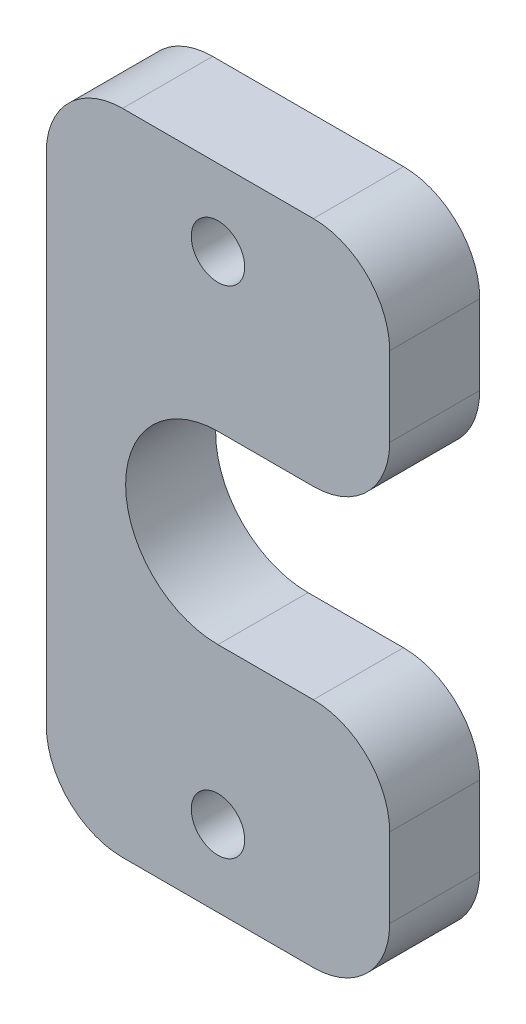
ISO-10303-21;
HEADER;
FILE_DESCRIPTION(('STEP AP214'),'2;1');
FILE_NAME('part.step','',(''),(''),'','','');
FILE_SCHEMA(('AUTOMOTIVE_DESIGN { 1 0 10303 214 1 1 1 1 }'));
ENDSEC;
DATA;
#1=APPLICATION_CONTEXT('core data for automotive mechanical design processes');
#2=APPLICATION_PROTOCOL_DEFINITION('international standard','automotive_design',2000,#1);
#3=PRODUCT_CONTEXT('',#1,'mechanical');
#4=PRODUCT('Part','Part','',(#3));
#5=PRODUCT_RELATED_PRODUCT_CATEGORY('part','',(#4));
#6=PRODUCT_DEFINITION_FORMATION('','',#4);
#7=PRODUCT_DEFINITION_CONTEXT('part definition',#1,'design');
#8=PRODUCT_DEFINITION('design','',#6,#7);
#9=PRODUCT_DEFINITION_SHAPE('','',#8);
#10=(LENGTH_UNIT() NAMED_UNIT(*) SI_UNIT(.MILLI.,.METRE.));
#11=(NAMED_UNIT(*) PLANE_ANGLE_UNIT() SI_UNIT($,.RADIAN.));
#12=(NAMED_UNIT(*) SI_UNIT($,.STERADIAN.) SOLID_ANGLE_UNIT());
#13=UNCERTAINTY_MEASURE_WITH_UNIT(LENGTH_MEASURE(1.E-05),#10,'distance_accuracy_value','');
#14=(GEOMETRIC_REPRESENTATION_CONTEXT(3) GLOBAL_UNCERTAINTY_ASSIGNED_CONTEXT((#13)) GLOBAL_UNIT_ASSIGNED_CONTEXT((#10,
#11,#12)) REPRESENTATION_CONTEXT('',''));
#15=CARTESIAN_POINT('',(0.,0.,0.));
#16=DIRECTION('',(0.,0.,1.));
#17=DIRECTION('',(1.,0.,0.));
#18=AXIS2_PLACEMENT_3D('',#15,#16,#17);
#19=CARTESIAN_POINT('',(0.,-16.2499999999999,5.9));
#20=DIRECTION('',(0.,0.,-1.));
#21=DIRECTION('',(-1.,0.,0.));
#22=AXIS2_PLACEMENT_3D('',#19,#20,#21);
#23=CYLINDRICAL_SURFACE('',#22,1.74999999999992);
#24=CARTESIAN_POINT('',(0.,-16.2499999999999,5.9));
#25=DIRECTION('',(0.,0.,1.));
#26=DIRECTION('',(1.,0.,0.));
#27=AXIS2_PLACEMENT_3D('',#24,#25,#26);
#28=CIRCLE('',#27,1.74999999999992);
#29=CARTESIAN_POINT('',(1.74999999999992,-16.2499999999999,5.9));
#30=VERTEX_POINT('',#29);
#31=EDGE_CURVE('E311',#30,#30,#28,.T.);
#32=ORIENTED_EDGE('',*,*,#31,.T.);
#33=EDGE_LOOP('',(#32));
#34=FACE_BOUND('',#33,.T.);
#35=CARTESIAN_POINT('',(0.,-16.2499999999999,2.5));
#36=DIRECTION('',(0.,0.,-1.));
#37=DIRECTION('',(-1.,0.,0.));
#38=AXIS2_PLACEMENT_3D('',#35,#36,#37);
#39=CIRCLE('',#38,1.74999999999992);
#40=CARTESIAN_POINT('',(-1.74999999999992,-16.2499999999999,2.5));
#41=VERTEX_POINT('',#40);
#42=EDGE_CURVE('E39',#41,#41,#39,.T.);
#43=ORIENTED_EDGE('',*,*,#42,.T.);
#44=EDGE_LOOP('',(#43));
#45=FACE_BOUND('',#44,.T.);
#46=ADVANCED_FACE('F35',(#34,#45),#23,.F.);
#47=CARTESIAN_POINT('',(0.,16.2500000000003,5.9));
#48=DIRECTION('',(0.,0.,-1.));
#49=DIRECTION('',(-1.,0.,0.));
#50=AXIS2_PLACEMENT_3D('',#47,#48,#49);
#51=CYLINDRICAL_SURFACE('',#50,1.74999999999992);
#52=CARTESIAN_POINT('',(0.,16.2500000000003,5.9));
#53=DIRECTION('',(0.,0.,1.));
#54=DIRECTION('',(1.,0.,0.));
#55=AXIS2_PLACEMENT_3D('',#52,#53,#54);
#56=CIRCLE('',#55,1.74999999999992);
#57=CARTESIAN_POINT('',(1.74999999999992,16.2500000000003,5.9));
#58=VERTEX_POINT('',#57);
#59=EDGE_CURVE('E314',#58,#58,#56,.T.);
#60=ORIENTED_EDGE('',*,*,#59,.T.);
#61=EDGE_LOOP('',(#60));
#62=FACE_BOUND('',#61,.T.);
#63=CARTESIAN_POINT('',(0.,16.2500000000003,2.5));
#64=DIRECTION('',(0.,0.,-1.));
#65=DIRECTION('',(-1.,0.,0.));
#66=AXIS2_PLACEMENT_3D('',#63,#64,#65);
#67=CIRCLE('',#66,1.74999999999992);
#68=CARTESIAN_POINT('',(-1.74999999999992,16.2500000000003,2.5));
#69=VERTEX_POINT('',#68);
#70=EDGE_CURVE('E301',#69,#69,#67,.T.);
#71=ORIENTED_EDGE('',*,*,#70,.T.);
#72=EDGE_LOOP('',(#71));
#73=FACE_BOUND('',#72,.T.);
#74=ADVANCED_FACE('F415',(#62,#73),#51,.F.);
#75=CARTESIAN_POINT('',(-6.25000000000142,16.2500000000003,5.9));
#76=DIRECTION('',(0.,0.,1.));
#77=DIRECTION('',(1.,0.,0.));
#78=AXIS2_PLACEMENT_3D('',#75,#76,#77);
#79=PLANE('',#78);
#80=ORIENTED_EDGE('',*,*,#59,.F.);
#81=EDGE_LOOP('',(#80));
#82=FACE_BOUND('',#81,.T.);
#83=CARTESIAN_POINT('',(-6.25000000000142,16.2500000000003,5.9));
#84=DIRECTION('',(0.,0.,1.));
#85=DIRECTION('',(1.,0.,0.));
#86=AXIS2_PLACEMENT_3D('',#83,#84,#85);
#87=CIRCLE('',#86,5.00000000000012);
#88=CARTESIAN_POINT('',(-6.25000000000009,21.2500000000002,5.9));
#89=VERTEX_POINT('',#88);
#90=CARTESIAN_POINT('',(-11.2500000000018,16.2500000000003,5.9));
#91=VERTEX_POINT('',#90);
#92=EDGE_CURVE('E318',#89,#91,#87,.T.);
#93=ORIENTED_EDGE('',*,*,#92,.T.);
#94=DIRECTION('',(0.,-1.,0.));
#95=VECTOR('',#94,1.);
#96=CARTESIAN_POINT('',(-11.2500000000018,16.2500000000003,5.9));
#97=LINE('',#96,#95);
#98=CARTESIAN_POINT('',(-11.2500000000018,-16.2500000000008,5.9));
#99=VERTEX_POINT('',#98);
#100=EDGE_CURVE('E321',#91,#99,#97,.T.);
#101=ORIENTED_EDGE('',*,*,#100,.T.);
#102=CARTESIAN_POINT('',(-6.25000000000164,-16.2500000000008,5.9));
#103=DIRECTION('',(0.,0.,1.));
#104=DIRECTION('',(1.,0.,0.));
#105=AXIS2_PLACEMENT_3D('',#102,#103,#104);
#106=CIRCLE('',#105,5.00000000000012);
#107=CARTESIAN_POINT('',(-6.25000000000164,-21.2500000000009,5.9));
#108=VERTEX_POINT('',#107);
#109=EDGE_CURVE('E324',#99,#108,#106,.T.);
#110=ORIENTED_EDGE('',*,*,#109,.T.);
#111=DIRECTION('',(1.,0.,0.));
#112=VECTOR('',#111,1.);
#113=CARTESIAN_POINT('',(-6.25000000000164,-21.2500000000009,5.9));
#114=LINE('',#113,#112);
#115=CARTESIAN_POINT('',(6.24999999999809,-21.2500000000009,5.9));
#116=VERTEX_POINT('',#115);
#117=EDGE_CURVE('E326',#108,#116,#114,.T.);
#118=ORIENTED_EDGE('',*,*,#117,.T.);
#119=CARTESIAN_POINT('',(6.24999999999809,-16.2500000000008,5.9));
#120=DIRECTION('',(0.,0.,1.));
#121=DIRECTION('',(1.,0.,0.));
#122=AXIS2_PLACEMENT_3D('',#119,#120,#121);
#123=CIRCLE('',#122,5.00000000000012);
#124=CARTESIAN_POINT('',(11.2499999999982,-16.2500000000008,5.9));
#125=VERTEX_POINT('',#124);
#126=EDGE_CURVE('E328',#116,#125,#123,.T.);
#127=ORIENTED_EDGE('',*,*,#126,.T.);
#128=DIRECTION('',(0.,1.,0.));
#129=VECTOR('',#128,1.);
#130=CARTESIAN_POINT('',(11.2499999999982,-11.0500000000009,5.9));
#131=LINE('',#130,#129);
#132=CARTESIAN_POINT('',(11.2499999999982,-11.0500000000009,5.9));
#133=VERTEX_POINT('',#132);
#134=EDGE_CURVE('E330',#125,#133,#131,.T.);
#135=ORIENTED_EDGE('',*,*,#134,.T.);
#136=CARTESIAN_POINT('',(6.24999999999809,-11.0500000000009,5.9));
#137=DIRECTION('',(0.,0.,1.));
#138=DIRECTION('',(1.,0.,0.));
#139=AXIS2_PLACEMENT_3D('',#136,#137,#138);
#140=CIRCLE('',#139,5.00000000000012);
#141=CARTESIAN_POINT('',(6.24999999999809,-6.05000000000078,5.9));
#142=VERTEX_POINT('',#141);
#143=EDGE_CURVE('E332',#133,#142,#140,.T.);
#144=ORIENTED_EDGE('',*,*,#143,.T.);
#145=DIRECTION('',(-1.,0.,0.));
#146=VECTOR('',#145,1.);
#147=CARTESIAN_POINT('',(-1.55431223447522E-12,-6.05000000000078,5.9));
#148=LINE('',#147,#146);
#149=CARTESIAN_POINT('',(-1.55431223447522E-12,-6.05000000000078,5.9));
#150=VERTEX_POINT('',#149);
#151=EDGE_CURVE('E334',#142,#150,#148,.T.);
#152=ORIENTED_EDGE('',*,*,#151,.T.);
#153=CARTESIAN_POINT('',(-1.55431223447522E-12,-4.44089209850063E-13,5.9));
#154=DIRECTION('',(0.,0.,-1.));
#155=DIRECTION('',(1.,0.,0.));
#156=AXIS2_PLACEMENT_3D('',#153,#154,#155);
#157=CIRCLE('',#156,6.05000000000033);
#158=CARTESIAN_POINT('',(-1.55394177881848E-12,6.04999999999989,5.9));
#159=VERTEX_POINT('',#158);
#160=EDGE_CURVE('E336',#150,#159,#157,.T.);
#161=ORIENTED_EDGE('',*,*,#160,.T.);
#162=DIRECTION('',(1.,0.,0.));
#163=VECTOR('',#162,1.);
#164=CARTESIAN_POINT('',(-1.55431223447522E-12,6.04999999999989,5.9));
#165=LINE('',#164,#163);
#166=CARTESIAN_POINT('',(6.24999999999809,6.04999999999989,5.9));
#167=VERTEX_POINT('',#166);
#168=EDGE_CURVE('E338',#159,#167,#165,.T.);
#169=ORIENTED_EDGE('',*,*,#168,.T.);
#170=CARTESIAN_POINT('',(6.24999999999809,11.05,5.9));
#171=DIRECTION('',(0.,0.,1.));
#172=DIRECTION('',(1.,0.,0.));
#173=AXIS2_PLACEMENT_3D('',#170,#171,#172);
#174=CIRCLE('',#173,5.00000000000012);
#175=CARTESIAN_POINT('',(11.2499999999982,11.05,5.9));
#176=VERTEX_POINT('',#175);
#177=EDGE_CURVE('E340',#167,#176,#174,.T.);
#178=ORIENTED_EDGE('',*,*,#177,.T.);
#179=DIRECTION('',(0.,1.,0.));
#180=VECTOR('',#179,1.);
#181=CARTESIAN_POINT('',(11.2499999999982,16.2499999999999,5.9));
#182=LINE('',#181,#180);
#183=CARTESIAN_POINT('',(11.2499999999982,16.2499999999999,5.9));
#184=VERTEX_POINT('',#183);
#185=EDGE_CURVE('E342',#176,#184,#182,.T.);
#186=ORIENTED_EDGE('',*,*,#185,.T.);
#187=CARTESIAN_POINT('',(6.24999999999809,16.2500000000003,5.9));
#188=DIRECTION('',(0.,0.,1.));
#189=DIRECTION('',(1.,0.,0.));
#190=AXIS2_PLACEMENT_3D('',#187,#188,#189);
#191=CIRCLE('',#190,5.);
#192=CARTESIAN_POINT('',(6.24999999999964,21.2500000000003,5.9));
#193=VERTEX_POINT('',#192);
#194=EDGE_CURVE('E344',#184,#193,#191,.T.);
#195=ORIENTED_EDGE('',*,*,#194,.T.);
#196=DIRECTION('',(-1.,0.,0.));
#197=VECTOR('',#196,1.);
#198=CARTESIAN_POINT('',(-6.25000000000009,21.2500000000002,5.9));
#199=LINE('',#198,#197);
#200=EDGE_CURVE('E346',#193,#89,#199,.T.);
#201=ORIENTED_EDGE('',*,*,#200,.T.);
#202=EDGE_LOOP('',(#93,#101,#110,#118,#127,#135,#144,#152,#161,#169,#178,#186,#195,#201));
#203=FACE_BOUND('',#202,.T.);
#204=ORIENTED_EDGE('',*,*,#31,.F.);
#205=EDGE_LOOP('',(#204));
#206=FACE_BOUND('',#205,.T.);
#207=ADVANCED_FACE('F447',(#82,#203,#206),#79,.T.);
#208=CARTESIAN_POINT('',(-6.25000000000142,16.2500000000003,0.));
#209=DIRECTION('',(0.,0.,1.));
#210=DIRECTION('',(1.,0.,0.));
#211=AXIS2_PLACEMENT_3D('',#208,#209,#210);
#212=PLANE('',#211);
#213=DIRECTION('',(0.5,-0.866025403784439,0.));
#214=VECTOR('',#213,1.);
#215=CARTESIAN_POINT('',(1.64544826719043,-13.3999999999999,0.));
#216=LINE('',#215,#214);
#217=CARTESIAN_POINT('',(1.64544826719044,-13.3999999999999,0.));
#218=VERTEX_POINT('',#217);
#219=CARTESIAN_POINT('',(3.29089653438087,-16.2499999999999,0.));
#220=VERTEX_POINT('',#219);
#221=EDGE_CURVE('E245',#218,#220,#216,.T.);
#222=ORIENTED_EDGE('',*,*,#221,.F.);
#223=DIRECTION('',(1.,0.,0.));
#224=VECTOR('',#223,1.);
#225=CARTESIAN_POINT('',(-1.64544826719043,-13.3999999999999,0.));
#226=LINE('',#225,#224);
#227=CARTESIAN_POINT('',(-1.64544826719043,-13.3999999999999,0.));
#228=VERTEX_POINT('',#227);
#229=EDGE_CURVE('E52',#228,#218,#226,.T.);
#230=ORIENTED_EDGE('',*,*,#229,.F.);
#231=DIRECTION('',(0.500000000000001,0.866025403784438,0.));
#232=VECTOR('',#231,1.);
#233=CARTESIAN_POINT('',(-3.29089653438087,-16.2499999999999,0.));
#234=LINE('',#233,#232);
#235=CARTESIAN_POINT('',(-3.29089653438087,-16.2499999999999,0.));
#236=VERTEX_POINT('',#235);
#237=EDGE_CURVE('E231',#236,#228,#234,.T.);
#238=ORIENTED_EDGE('',*,*,#237,.F.);
#239=DIRECTION('',(-0.5,0.866025403784439,0.));
#240=VECTOR('',#239,1.);
#241=CARTESIAN_POINT('',(-1.64544826719044,-19.0999999999999,0.));
#242=LINE('',#241,#240);
#243=CARTESIAN_POINT('',(-1.64544826719044,-19.0999999999999,0.));
#244=VERTEX_POINT('',#243);
#245=EDGE_CURVE('E234',#244,#236,#242,.T.);
#246=ORIENTED_EDGE('',*,*,#245,.F.);
#247=DIRECTION('',(-1.,0.,0.));
#248=VECTOR('',#247,1.);
#249=CARTESIAN_POINT('',(1.64544826719043,-19.0999999999999,0.));
#250=LINE('',#249,#248);
#251=CARTESIAN_POINT('',(1.64544826719043,-19.0999999999999,0.));
#252=VERTEX_POINT('',#251);
#253=EDGE_CURVE('E250',#252,#244,#250,.T.);
#254=ORIENTED_EDGE('',*,*,#253,.F.);
#255=DIRECTION('',(-0.5,-0.866025403784439,0.));
#256=VECTOR('',#255,1.);
#257=CARTESIAN_POINT('',(3.29089653438087,-16.2499999999999,0.));
#258=LINE('',#257,#256);
#259=EDGE_CURVE('E247',#220,#252,#258,.T.);
#260=ORIENTED_EDGE('',*,*,#259,.F.);
#261=EDGE_LOOP('',(#222,#230,#238,#246,#254,#260));
#262=FACE_BOUND('',#261,.T.);
#263=DIRECTION('',(-0.5,0.866025403784439,0.));
#264=VECTOR('',#263,1.);
#265=CARTESIAN_POINT('',(-1.64544826719043,13.4000000000003,0.));
#266=LINE('',#265,#264);
#267=CARTESIAN_POINT('',(-1.64544826719043,13.4000000000003,0.));
#268=VERTEX_POINT('',#267);
#269=CARTESIAN_POINT('',(-3.29089653438087,16.2500000000003,0.));
#270=VERTEX_POINT('',#269);
#271=EDGE_CURVE('E285',#268,#270,#266,.T.);
#272=ORIENTED_EDGE('',*,*,#271,.F.);
#273=DIRECTION('',(-1.,0.,0.));
#274=VECTOR('',#273,1.);
#275=CARTESIAN_POINT('',(1.64544826719044,13.4000000000003,0.));
#276=LINE('',#275,#274);
#277=CARTESIAN_POINT('',(1.64544826719044,13.4000000000003,0.));
#278=VERTEX_POINT('',#277);
#279=EDGE_CURVE('E60',#278,#268,#276,.T.);
#280=ORIENTED_EDGE('',*,*,#279,.F.);
#281=DIRECTION('',(-0.5,-0.866025403784438,0.));
#282=VECTOR('',#281,1.);
#283=CARTESIAN_POINT('',(3.29089653438087,16.2500000000003,0.));
#284=LINE('',#283,#282);
#285=CARTESIAN_POINT('',(3.29089653438087,16.2500000000003,0.));
#286=VERTEX_POINT('',#285);
#287=EDGE_CURVE('E268',#286,#278,#284,.T.);
#288=ORIENTED_EDGE('',*,*,#287,.F.);
#289=DIRECTION('',(0.5,-0.866025403784439,0.));
#290=VECTOR('',#289,1.);
#291=CARTESIAN_POINT('',(1.64544826719044,19.1000000000003,0.));
#292=LINE('',#291,#290);
#293=CARTESIAN_POINT('',(1.64544826719044,19.1000000000003,0.));
#294=VERTEX_POINT('',#293);
#295=EDGE_CURVE('E294',#294,#286,#292,.T.);
#296=ORIENTED_EDGE('',*,*,#295,.F.);
#297=DIRECTION('',(1.,0.,0.));
#298=VECTOR('',#297,1.);
#299=CARTESIAN_POINT('',(-1.64544826719043,19.1000000000003,0.));
#300=LINE('',#299,#298);
#301=CARTESIAN_POINT('',(-1.64544826719043,19.1000000000003,0.));
#302=VERTEX_POINT('',#301);
#303=EDGE_CURVE('E291',#302,#294,#300,.T.);
#304=ORIENTED_EDGE('',*,*,#303,.F.);
#305=DIRECTION('',(0.5,0.866025403784438,0.));
#306=VECTOR('',#305,1.);
#307=CARTESIAN_POINT('',(-3.29089653438087,16.2500000000003,0.));
#308=LINE('',#307,#306);
#309=EDGE_CURVE('E288',#270,#302,#308,.T.);
#310=ORIENTED_EDGE('',*,*,#309,.F.);
#311=EDGE_LOOP('',(#272,#280,#288,#296,#304,#310));
#312=FACE_BOUND('',#311,.T.);
#313=CARTESIAN_POINT('',(-6.25000000000142,16.2500000000003,0.));
#314=DIRECTION('',(0.,0.,1.));
#315=DIRECTION('',(1.,0.,0.));
#316=AXIS2_PLACEMENT_3D('',#313,#314,#315);
#317=CIRCLE('',#316,5.00000000000012);
#318=CARTESIAN_POINT('',(-6.25000000000009,21.2500000000002,0.));
#319=VERTEX_POINT('',#318);
#320=CARTESIAN_POINT('',(-11.2500000000018,16.2500000000003,0.));
#321=VERTEX_POINT('',#320);
#322=EDGE_CURVE('E317',#319,#321,#317,.T.);
#323=ORIENTED_EDGE('',*,*,#322,.F.);
#324=DIRECTION('',(-1.,0.,0.));
#325=VECTOR('',#324,1.);
#326=CARTESIAN_POINT('',(-6.25000000000009,21.2500000000002,0.));
#327=LINE('',#326,#325);
#328=CARTESIAN_POINT('',(6.24999999999964,21.2500000000003,0.));
#329=VERTEX_POINT('',#328);
#330=EDGE_CURVE('E322',#329,#319,#327,.T.);
#331=ORIENTED_EDGE('',*,*,#330,.F.);
#332=CARTESIAN_POINT('',(6.24999999999809,16.2500000000003,0.));
#333=DIRECTION('',(0.,0.,1.));
#334=DIRECTION('',(1.,0.,0.));
#335=AXIS2_PLACEMENT_3D('',#332,#333,#334);
#336=CIRCLE('',#335,5.);
#337=CARTESIAN_POINT('',(11.2499999999982,16.2499999999999,0.));
#338=VERTEX_POINT('',#337);
#339=EDGE_CURVE('E373',#338,#329,#336,.T.);
#340=ORIENTED_EDGE('',*,*,#339,.F.);
#341=DIRECTION('',(0.,1.,0.));
#342=VECTOR('',#341,1.);
#343=CARTESIAN_POINT('',(11.2499999999982,16.2499999999999,0.));
#344=LINE('',#343,#342);
#345=CARTESIAN_POINT('',(11.2499999999982,11.05,0.));
#346=VERTEX_POINT('',#345);
#347=EDGE_CURVE('E371',#346,#338,#344,.T.);
#348=ORIENTED_EDGE('',*,*,#347,.F.);
#349=CARTESIAN_POINT('',(6.24999999999809,11.05,0.));
#350=DIRECTION('',(0.,0.,1.));
#351=DIRECTION('',(1.,0.,0.));
#352=AXIS2_PLACEMENT_3D('',#349,#350,#351);
#353=CIRCLE('',#352,5.00000000000012);
#354=CARTESIAN_POINT('',(6.24999999999809,6.04999999999989,0.));
#355=VERTEX_POINT('',#354);
#356=EDGE_CURVE('E369',#355,#346,#353,.T.);
#357=ORIENTED_EDGE('',*,*,#356,.F.);
#358=DIRECTION('',(1.,0.,0.));
#359=VECTOR('',#358,1.);
#360=CARTESIAN_POINT('',(-1.55431223447522E-12,6.04999999999989,0.));
#361=LINE('',#360,#359);
#362=CARTESIAN_POINT('',(-1.55394177881848E-12,6.04999999999989,0.));
#363=VERTEX_POINT('',#362);
#364=EDGE_CURVE('E367',#363,#355,#361,.T.);
#365=ORIENTED_EDGE('',*,*,#364,.F.);
#366=CARTESIAN_POINT('',(-1.55431223447522E-12,-4.44089209850063E-13,0.));
#367=DIRECTION('',(0.,0.,-1.));
#368=DIRECTION('',(1.,0.,0.));
#369=AXIS2_PLACEMENT_3D('',#366,#367,#368);
#370=CIRCLE('',#369,6.05000000000033);
#371=CARTESIAN_POINT('',(-1.55431223447522E-12,-6.05000000000078,0.));
#372=VERTEX_POINT('',#371);
#373=EDGE_CURVE('E365',#372,#363,#370,.T.);
#374=ORIENTED_EDGE('',*,*,#373,.F.);
#375=DIRECTION('',(-1.,0.,0.));
#376=VECTOR('',#375,1.);
#377=CARTESIAN_POINT('',(-1.55431223447522E-12,-6.05000000000078,0.));
#378=LINE('',#377,#376);
#379=CARTESIAN_POINT('',(6.24999999999809,-6.05000000000078,0.));
#380=VERTEX_POINT('',#379);
#381=EDGE_CURVE('E363',#380,#372,#378,.T.);
#382=ORIENTED_EDGE('',*,*,#381,.F.);
#383=CARTESIAN_POINT('',(6.24999999999809,-11.0500000000009,0.));
#384=DIRECTION('',(0.,0.,1.));
#385=DIRECTION('',(1.,0.,0.));
#386=AXIS2_PLACEMENT_3D('',#383,#384,#385);
#387=CIRCLE('',#386,5.00000000000012);
#388=CARTESIAN_POINT('',(11.2499999999982,-11.0500000000009,0.));
#389=VERTEX_POINT('',#388);
#390=EDGE_CURVE('E361',#389,#380,#387,.T.);
#391=ORIENTED_EDGE('',*,*,#390,.F.);
#392=DIRECTION('',(0.,1.,0.));
#393=VECTOR('',#392,1.);
#394=CARTESIAN_POINT('',(11.2499999999982,-11.0500000000009,0.));
#395=LINE('',#394,#393);
#396=CARTESIAN_POINT('',(11.2499999999982,-16.2500000000008,0.));
#397=VERTEX_POINT('',#396);
#398=EDGE_CURVE('E359',#397,#389,#395,.T.);
#399=ORIENTED_EDGE('',*,*,#398,.F.);
#400=CARTESIAN_POINT('',(6.24999999999809,-16.2500000000008,0.));
#401=DIRECTION('',(0.,0.,1.));
#402=DIRECTION('',(1.,0.,0.));
#403=AXIS2_PLACEMENT_3D('',#400,#401,#402);
#404=CIRCLE('',#403,5.00000000000012);
#405=CARTESIAN_POINT('',(6.24999999999809,-21.2500000000009,0.));
#406=VERTEX_POINT('',#405);
#407=EDGE_CURVE('E357',#406,#397,#404,.T.);
#408=ORIENTED_EDGE('',*,*,#407,.F.);
#409=DIRECTION('',(1.,0.,0.));
#410=VECTOR('',#409,1.);
#411=CARTESIAN_POINT('',(-6.25000000000164,-21.2500000000009,0.));
#412=LINE('',#411,#410);
#413=CARTESIAN_POINT('',(-6.25000000000164,-21.2500000000009,0.));
#414=VERTEX_POINT('',#413);
#415=EDGE_CURVE('E355',#414,#406,#412,.T.);
#416=ORIENTED_EDGE('',*,*,#415,.F.);
#417=CARTESIAN_POINT('',(-6.25000000000164,-16.2500000000008,0.));
#418=DIRECTION('',(0.,0.,1.));
#419=DIRECTION('',(1.,0.,0.));
#420=AXIS2_PLACEMENT_3D('',#417,#418,#419);
#421=CIRCLE('',#420,5.00000000000012);
#422=CARTESIAN_POINT('',(-11.2500000000018,-16.2500000000008,0.));
#423=VERTEX_POINT('',#422);
#424=EDGE_CURVE('E353',#423,#414,#421,.T.);
#425=ORIENTED_EDGE('',*,*,#424,.F.);
#426=DIRECTION('',(0.,-1.,0.));
#427=VECTOR('',#426,1.);
#428=CARTESIAN_POINT('',(-11.2500000000018,16.2500000000003,0.));
#429=LINE('',#428,#427);
#430=EDGE_CURVE('E351',#321,#423,#429,.T.);
#431=ORIENTED_EDGE('',*,*,#430,.F.);
#432=EDGE_LOOP('',(#323,#331,#340,#348,#357,#365,#374,#382,#391,#399,#408,#416,#425,#431));
#433=FACE_BOUND('',#432,.T.);
#434=ADVANCED_FACE('F444',(#262,#312,#433),#212,.F.);
#435=CARTESIAN_POINT('',(-6.25000000000142,16.2500000000003,5.9));
#436=DIRECTION('',(0.,0.,-1.));
#437=DIRECTION('',(-1.,0.,0.));
#438=AXIS2_PLACEMENT_3D('',#435,#436,#437);
#439=CYLINDRICAL_SURFACE('',#438,5.00000000000012);
#440=ORIENTED_EDGE('',*,*,#322,.T.);
#441=DIRECTION('',(0.,0.,-1.));
#442=VECTOR('',#441,1.);
#443=CARTESIAN_POINT('',(-11.2500000000018,16.2500000000003,5.9));
#444=LINE('',#443,#442);
#445=EDGE_CURVE('E11',#91,#321,#444,.T.);
#446=ORIENTED_EDGE('',*,*,#445,.F.);
#447=ORIENTED_EDGE('',*,*,#92,.F.);
#448=DIRECTION('',(0.,0.,-1.));
#449=VECTOR('',#448,1.);
#450=CARTESIAN_POINT('',(-6.25000000000009,21.2500000000002,5.9));
#451=LINE('',#450,#449);
#452=EDGE_CURVE('E348',#89,#319,#451,.T.);
#453=ORIENTED_EDGE('',*,*,#452,.T.);
#454=EDGE_LOOP('',(#440,#446,#447,#453));
#455=FACE_BOUND('',#454,.T.);
#456=ADVANCED_FACE('F37',(#455),#439,.T.);
#457=CARTESIAN_POINT('',(-11.2500000000018,16.2500000000003,5.9));
#458=DIRECTION('',(1.,0.,0.));
#459=DIRECTION('',(0.,0.,-1.));
#460=AXIS2_PLACEMENT_3D('',#457,#458,#459);
#461=PLANE('',#460);
#462=ORIENTED_EDGE('',*,*,#430,.T.);
#463=DIRECTION('',(0.,0.,-1.));
#464=VECTOR('',#463,1.);
#465=CARTESIAN_POINT('',(-11.2500000000018,-16.2500000000008,5.9));
#466=LINE('',#465,#464);
#467=EDGE_CURVE('E44',#99,#423,#466,.T.);
#468=ORIENTED_EDGE('',*,*,#467,.F.);
#469=ORIENTED_EDGE('',*,*,#100,.F.);
#470=ORIENTED_EDGE('',*,*,#445,.T.);
#471=EDGE_LOOP('',(#462,#468,#469,#470));
#472=FACE_BOUND('',#471,.T.);
#473=ADVANCED_FACE('F516',(#472),#461,.F.);
#474=CARTESIAN_POINT('',(-6.25000000000164,-16.2500000000008,5.9));
#475=DIRECTION('',(0.,0.,-1.));
#476=DIRECTION('',(-1.,0.,0.));
#477=AXIS2_PLACEMENT_3D('',#474,#475,#476);
#478=CYLINDRICAL_SURFACE('',#477,5.00000000000012);
#479=ORIENTED_EDGE('',*,*,#424,.T.);
#480=DIRECTION('',(0.,0.,-1.));
#481=VECTOR('',#480,1.);
#482=CARTESIAN_POINT('',(-6.25000000000164,-21.2500000000009,5.9));
#483=LINE('',#482,#481);
#484=EDGE_CURVE('E408',#108,#414,#483,.T.);
#485=ORIENTED_EDGE('',*,*,#484,.F.);
#486=ORIENTED_EDGE('',*,*,#109,.F.);
#487=ORIENTED_EDGE('',*,*,#467,.T.);
#488=EDGE_LOOP('',(#479,#485,#486,#487));
#489=FACE_BOUND('',#488,.T.);
#490=ADVANCED_FACE('F512',(#489),#478,.T.);
#491=CARTESIAN_POINT('',(-6.25000000000164,-21.2500000000009,5.9));
#492=DIRECTION('',(0.,1.,0.));
#493=DIRECTION('',(0.,0.,1.));
#494=AXIS2_PLACEMENT_3D('',#491,#492,#493);
#495=PLANE('',#494);
#496=ORIENTED_EDGE('',*,*,#415,.T.);
#497=DIRECTION('',(0.,0.,-1.));
#498=VECTOR('',#497,1.);
#499=CARTESIAN_POINT('',(6.24999999999809,-21.2500000000009,5.9));
#500=LINE('',#499,#498);
#501=EDGE_CURVE('E405',#116,#406,#500,.T.);
#502=ORIENTED_EDGE('',*,*,#501,.F.);
#503=ORIENTED_EDGE('',*,*,#117,.F.);
#504=ORIENTED_EDGE('',*,*,#484,.T.);
#505=EDGE_LOOP('',(#496,#502,#503,#504));
#506=FACE_BOUND('',#505,.T.);
#507=ADVANCED_FACE('F509',(#506),#495,.F.);
#508=CARTESIAN_POINT('',(6.24999999999809,-16.2500000000008,5.9));
#509=DIRECTION('',(0.,0.,-1.));
#510=DIRECTION('',(-1.,0.,0.));
#511=AXIS2_PLACEMENT_3D('',#508,#509,#510);
#512=CYLINDRICAL_SURFACE('',#511,5.00000000000012);
#513=ORIENTED_EDGE('',*,*,#407,.T.);
#514=DIRECTION('',(0.,0.,-1.));
#515=VECTOR('',#514,1.);
#516=CARTESIAN_POINT('',(11.2499999999982,-16.2500000000008,5.9));
#517=LINE('',#516,#515);
#518=EDGE_CURVE('E402',#125,#397,#517,.T.);
#519=ORIENTED_EDGE('',*,*,#518,.F.);
#520=ORIENTED_EDGE('',*,*,#126,.F.);
#521=ORIENTED_EDGE('',*,*,#501,.T.);
#522=EDGE_LOOP('',(#513,#519,#520,#521));
#523=FACE_BOUND('',#522,.T.);
#524=ADVANCED_FACE('F505',(#523),#512,.T.);
#525=CARTESIAN_POINT('',(11.2499999999982,-11.0500000000009,5.9));
#526=DIRECTION('',(-1.,0.,0.));
#527=DIRECTION('',(0.,0.,1.));
#528=AXIS2_PLACEMENT_3D('',#525,#526,#527);
#529=PLANE('',#528);
#530=ORIENTED_EDGE('',*,*,#398,.T.);
#531=DIRECTION('',(0.,0.,-1.));
#532=VECTOR('',#531,1.);
#533=CARTESIAN_POINT('',(11.2499999999982,-11.0500000000009,5.9));
#534=LINE('',#533,#532);
#535=EDGE_CURVE('E399',#133,#389,#534,.T.);
#536=ORIENTED_EDGE('',*,*,#535,.F.);
#537=ORIENTED_EDGE('',*,*,#134,.F.);
#538=ORIENTED_EDGE('',*,*,#518,.T.);
#539=EDGE_LOOP('',(#530,#536,#537,#538));
#540=FACE_BOUND('',#539,.T.);
#541=ADVANCED_FACE('F500',(#540),#529,.F.);
#542=CARTESIAN_POINT('',(6.24999999999809,-11.0500000000009,5.9));
#543=DIRECTION('',(0.,0.,-1.));
#544=DIRECTION('',(-1.,0.,0.));
#545=AXIS2_PLACEMENT_3D('',#542,#543,#544);
#546=CYLINDRICAL_SURFACE('',#545,5.00000000000012);
#547=ORIENTED_EDGE('',*,*,#390,.T.);
#548=DIRECTION('',(0.,0.,-1.));
#549=VECTOR('',#548,1.);
#550=CARTESIAN_POINT('',(6.24999999999809,-6.05000000000078,5.9));
#551=LINE('',#550,#549);
#552=EDGE_CURVE('E396',#142,#380,#551,.T.);
#553=ORIENTED_EDGE('',*,*,#552,.F.);
#554=ORIENTED_EDGE('',*,*,#143,.F.);
#555=ORIENTED_EDGE('',*,*,#535,.T.);
#556=EDGE_LOOP('',(#547,#553,#554,#555));
#557=FACE_BOUND('',#556,.T.);
#558=ADVANCED_FACE('F494',(#557),#546,.T.);
#559=CARTESIAN_POINT('',(-1.55431223447522E-12,-6.05000000000078,5.9));
#560=DIRECTION('',(0.,-1.,0.));
#561=DIRECTION('',(0.,0.,-1.));
#562=AXIS2_PLACEMENT_3D('',#559,#560,#561);
#563=PLANE('',#562);
#564=ORIENTED_EDGE('',*,*,#381,.T.);
#565=DIRECTION('',(0.,0.,-1.));
#566=VECTOR('',#565,1.);
#567=CARTESIAN_POINT('',(-1.55431223447522E-12,-6.05000000000078,5.9));
#568=LINE('',#567,#566);
#569=EDGE_CURVE('E393',#150,#372,#568,.T.);
#570=ORIENTED_EDGE('',*,*,#569,.F.);
#571=ORIENTED_EDGE('',*,*,#151,.F.);
#572=ORIENTED_EDGE('',*,*,#552,.T.);
#573=EDGE_LOOP('',(#564,#570,#571,#572));
#574=FACE_BOUND('',#573,.T.);
#575=ADVANCED_FACE('F490',(#574),#563,.F.);
#576=CARTESIAN_POINT('',(-1.55431223447522E-12,-4.44089209850063E-13,5.9));
#577=DIRECTION('',(0.,0.,-1.));
#578=DIRECTION('',(-1.,0.,0.));
#579=AXIS2_PLACEMENT_3D('',#576,#577,#578);
#580=CYLINDRICAL_SURFACE('',#579,6.05000000000033);
#581=ORIENTED_EDGE('',*,*,#373,.T.);
#582=DIRECTION('',(0.,0.,-1.));
#583=VECTOR('',#582,1.);
#584=CARTESIAN_POINT('',(-1.55394177881848E-12,6.04999999999989,5.9));
#585=LINE('',#584,#583);
#586=EDGE_CURVE('E390',#159,#363,#585,.T.);
#587=ORIENTED_EDGE('',*,*,#586,.F.);
#588=ORIENTED_EDGE('',*,*,#160,.F.);
#589=ORIENTED_EDGE('',*,*,#569,.T.);
#590=EDGE_LOOP('',(#581,#587,#588,#589));
#591=FACE_BOUND('',#590,.T.);
#592=ADVANCED_FACE('F485',(#591),#580,.F.);
#593=CARTESIAN_POINT('',(-1.55431223447522E-12,6.04999999999989,5.9));
#594=DIRECTION('',(0.,1.,0.));
#595=DIRECTION('',(0.,0.,1.));
#596=AXIS2_PLACEMENT_3D('',#593,#594,#595);
#597=PLANE('',#596);
#598=ORIENTED_EDGE('',*,*,#364,.T.);
#599=DIRECTION('',(0.,0.,-1.));
#600=VECTOR('',#599,1.);
#601=CARTESIAN_POINT('',(6.24999999999809,6.04999999999989,5.9));
#602=LINE('',#601,#600);
#603=EDGE_CURVE('E387',#167,#355,#602,.T.);
#604=ORIENTED_EDGE('',*,*,#603,.F.);
#605=ORIENTED_EDGE('',*,*,#168,.F.);
#606=ORIENTED_EDGE('',*,*,#586,.T.);
#607=EDGE_LOOP('',(#598,#604,#605,#606));
#608=FACE_BOUND('',#607,.T.);
#609=ADVANCED_FACE('F479',(#608),#597,.F.);
#610=CARTESIAN_POINT('',(6.24999999999809,11.05,5.9));
#611=DIRECTION('',(0.,0.,-1.));
#612=DIRECTION('',(-1.,0.,0.));
#613=AXIS2_PLACEMENT_3D('',#610,#611,#612);
#614=CYLINDRICAL_SURFACE('',#613,5.00000000000012);
#615=ORIENTED_EDGE('',*,*,#356,.T.);
#616=DIRECTION('',(0.,0.,-1.));
#617=VECTOR('',#616,1.);
#618=CARTESIAN_POINT('',(11.2499999999982,11.05,5.9));
#619=LINE('',#618,#617);
#620=EDGE_CURVE('E384',#176,#346,#619,.T.);
#621=ORIENTED_EDGE('',*,*,#620,.F.);
#622=ORIENTED_EDGE('',*,*,#177,.F.);
#623=ORIENTED_EDGE('',*,*,#603,.T.);
#624=EDGE_LOOP('',(#615,#621,#622,#623));
#625=FACE_BOUND('',#624,.T.);
#626=ADVANCED_FACE('F475',(#625),#614,.T.);
#627=CARTESIAN_POINT('',(11.2499999999982,16.2499999999999,5.9));
#628=DIRECTION('',(-1.,0.,0.));
#629=DIRECTION('',(0.,0.,1.));
#630=AXIS2_PLACEMENT_3D('',#627,#628,#629);
#631=PLANE('',#630);
#632=ORIENTED_EDGE('',*,*,#347,.T.);
#633=DIRECTION('',(0.,0.,-1.));
#634=VECTOR('',#633,1.);
#635=CARTESIAN_POINT('',(11.2499999999982,16.2499999999999,5.9));
#636=LINE('',#635,#634);
#637=EDGE_CURVE('E381',#184,#338,#636,.T.);
#638=ORIENTED_EDGE('',*,*,#637,.F.);
#639=ORIENTED_EDGE('',*,*,#185,.F.);
#640=ORIENTED_EDGE('',*,*,#620,.T.);
#641=EDGE_LOOP('',(#632,#638,#639,#640));
#642=FACE_BOUND('',#641,.T.);
#643=ADVANCED_FACE('F470',(#642),#631,.F.);
#644=CARTESIAN_POINT('',(6.24999999999809,16.2500000000003,5.9));
#645=DIRECTION('',(0.,0.,-1.));
#646=DIRECTION('',(-1.,0.,0.));
#647=AXIS2_PLACEMENT_3D('',#644,#645,#646);
#648=CYLINDRICAL_SURFACE('',#647,5.);
#649=ORIENTED_EDGE('',*,*,#339,.T.);
#650=DIRECTION('',(0.,0.,-1.));
#651=VECTOR('',#650,1.);
#652=CARTESIAN_POINT('',(6.24999999999964,21.2500000000003,5.9));
#653=LINE('',#652,#651);
#654=EDGE_CURVE('E378',#193,#329,#653,.T.);
#655=ORIENTED_EDGE('',*,*,#654,.F.);
#656=ORIENTED_EDGE('',*,*,#194,.F.);
#657=ORIENTED_EDGE('',*,*,#637,.T.);
#658=EDGE_LOOP('',(#649,#655,#656,#657));
#659=FACE_BOUND('',#658,.T.);
#660=ADVANCED_FACE('F464',(#659),#648,.T.);
#661=CARTESIAN_POINT('',(-6.25000000000009,21.2500000000002,5.9));
#662=DIRECTION('',(0.,-1.,0.));
#663=DIRECTION('',(0.,0.,-1.));
#664=AXIS2_PLACEMENT_3D('',#661,#662,#663);
#665=PLANE('',#664);
#666=ORIENTED_EDGE('',*,*,#330,.T.);
#667=ORIENTED_EDGE('',*,*,#452,.F.);
#668=ORIENTED_EDGE('',*,*,#200,.F.);
#669=ORIENTED_EDGE('',*,*,#654,.T.);
#670=EDGE_LOOP('',(#666,#667,#668,#669));
#671=FACE_BOUND('',#670,.T.);
#672=ADVANCED_FACE('F460',(#671),#665,.F.);
#673=CARTESIAN_POINT('',(1.64544826719044,13.4000000000003,2.5));
#674=DIRECTION('',(0.,-1.,0.));
#675=DIRECTION('',(0.,0.,-1.));
#676=AXIS2_PLACEMENT_3D('',#673,#674,#675);
#677=PLANE('',#676);
#678=ORIENTED_EDGE('',*,*,#279,.T.);
#679=DIRECTION('',(0.,0.,-1.));
#680=VECTOR('',#679,1.);
#681=CARTESIAN_POINT('',(-1.64544826719043,13.4000000000003,2.5));
#682=LINE('',#681,#680);
#683=CARTESIAN_POINT('',(-1.64544826719043,13.4000000000003,2.5));
#684=VERTEX_POINT('',#683);
#685=EDGE_CURVE('E283',#684,#268,#682,.T.);
#686=ORIENTED_EDGE('',*,*,#685,.F.);
#687=DIRECTION('',(-1.,0.,0.));
#688=VECTOR('',#687,1.);
#689=CARTESIAN_POINT('',(1.64544826719044,13.4000000000003,2.5));
#690=LINE('',#689,#688);
#691=CARTESIAN_POINT('',(1.64544826719044,13.4000000000003,2.5));
#692=VERTEX_POINT('',#691);
#693=EDGE_CURVE('E264',#692,#684,#690,.T.);
#694=ORIENTED_EDGE('',*,*,#693,.F.);
#695=DIRECTION('',(0.,0.,-1.));
#696=VECTOR('',#695,1.);
#697=CARTESIAN_POINT('',(1.64544826719044,13.4000000000003,2.5));
#698=LINE('',#697,#696);
#699=EDGE_CURVE('E299',#692,#278,#698,.T.);
#700=ORIENTED_EDGE('',*,*,#699,.T.);
#701=EDGE_LOOP('',(#678,#686,#694,#700));
#702=FACE_BOUND('',#701,.T.);
#703=ADVANCED_FACE('F425',(#702),#677,.F.);
#704=CARTESIAN_POINT('',(3.29089653438087,16.2500000000003,2.5));
#705=DIRECTION('',(0.866025403784438,-0.5,0.));
#706=DIRECTION('',(0.5,0.866025403784438,0.));
#707=AXIS2_PLACEMENT_3D('',#704,#705,#706);
#708=PLANE('',#707);
#709=ORIENTED_EDGE('',*,*,#287,.T.);
#710=ORIENTED_EDGE('',*,*,#699,.F.);
#711=DIRECTION('',(-0.5,-0.866025403784438,0.));
#712=VECTOR('',#711,1.);
#713=CARTESIAN_POINT('',(3.29089653438087,16.2500000000003,2.5));
#714=LINE('',#713,#712);
#715=CARTESIAN_POINT('',(3.29089653438087,16.2500000000003,2.5));
#716=VERTEX_POINT('',#715);
#717=EDGE_CURVE('E280',#716,#692,#714,.T.);
#718=ORIENTED_EDGE('',*,*,#717,.F.);
#719=DIRECTION('',(0.,0.,-1.));
#720=VECTOR('',#719,1.);
#721=CARTESIAN_POINT('',(3.29089653438087,16.2500000000003,2.5));
#722=LINE('',#721,#720);
#723=EDGE_CURVE('E302',#716,#286,#722,.T.);
#724=ORIENTED_EDGE('',*,*,#723,.T.);
#725=EDGE_LOOP('',(#709,#710,#718,#724));
#726=FACE_BOUND('',#725,.T.);
#727=ADVANCED_FACE('F442',(#726),#708,.F.);
#728=CARTESIAN_POINT('',(1.64544826719044,19.1000000000003,2.5));
#729=DIRECTION('',(0.866025403784439,0.5,0.));
#730=DIRECTION('',(-0.5,0.866025403784439,0.));
#731=AXIS2_PLACEMENT_3D('',#728,#729,#730);
#732=PLANE('',#731);
#733=ORIENTED_EDGE('',*,*,#295,.T.);
#734=ORIENTED_EDGE('',*,*,#723,.F.);
#735=DIRECTION('',(0.5,-0.866025403784439,0.));
#736=VECTOR('',#735,1.);
#737=CARTESIAN_POINT('',(1.64544826719044,19.1000000000003,2.5));
#738=LINE('',#737,#736);
#739=CARTESIAN_POINT('',(1.64544826719044,19.1000000000003,2.5));
#740=VERTEX_POINT('',#739);
#741=EDGE_CURVE('E277',#740,#716,#738,.T.);
#742=ORIENTED_EDGE('',*,*,#741,.F.);
#743=DIRECTION('',(0.,0.,-1.));
#744=VECTOR('',#743,1.);
#745=CARTESIAN_POINT('',(1.64544826719044,19.1000000000003,2.5));
#746=LINE('',#745,#744);
#747=EDGE_CURVE('E304',#740,#294,#746,.T.);
#748=ORIENTED_EDGE('',*,*,#747,.T.);
#749=EDGE_LOOP('',(#733,#734,#742,#748));
#750=FACE_BOUND('',#749,.T.);
#751=ADVANCED_FACE('F439',(#750),#732,.F.);
#752=CARTESIAN_POINT('',(-1.64544826719043,19.1000000000003,2.5));
#753=DIRECTION('',(0.,1.,0.));
#754=DIRECTION('',(0.,0.,1.));
#755=AXIS2_PLACEMENT_3D('',#752,#753,#754);
#756=PLANE('',#755);
#757=ORIENTED_EDGE('',*,*,#303,.T.);
#758=ORIENTED_EDGE('',*,*,#747,.F.);
#759=DIRECTION('',(1.,0.,0.));
#760=VECTOR('',#759,1.);
#761=CARTESIAN_POINT('',(-1.64544826719043,19.1000000000003,2.5));
#762=LINE('',#761,#760);
#763=CARTESIAN_POINT('',(-1.64544826719043,19.1000000000003,2.5));
#764=VERTEX_POINT('',#763);
#765=EDGE_CURVE('E274',#764,#740,#762,.T.);
#766=ORIENTED_EDGE('',*,*,#765,.F.);
#767=DIRECTION('',(0.,0.,-1.));
#768=VECTOR('',#767,1.);
#769=CARTESIAN_POINT('',(-1.64544826719043,19.1000000000003,2.5));
#770=LINE('',#769,#768);
#771=EDGE_CURVE('E306',#764,#302,#770,.T.);
#772=ORIENTED_EDGE('',*,*,#771,.T.);
#773=EDGE_LOOP('',(#757,#758,#766,#772));
#774=FACE_BOUND('',#773,.T.);
#775=ADVANCED_FACE('F435',(#774),#756,.F.);
#776=CARTESIAN_POINT('',(-3.29089653438087,16.2500000000003,2.5));
#777=DIRECTION('',(-0.866025403784438,0.5,0.));
#778=DIRECTION('',(-0.5,-0.866025403784438,0.));
#779=AXIS2_PLACEMENT_3D('',#776,#777,#778);
#780=PLANE('',#779);
#781=ORIENTED_EDGE('',*,*,#309,.T.);
#782=ORIENTED_EDGE('',*,*,#771,.F.);
#783=DIRECTION('',(0.5,0.866025403784438,0.));
#784=VECTOR('',#783,1.);
#785=CARTESIAN_POINT('',(-3.29089653438087,16.2500000000003,2.5));
#786=LINE('',#785,#784);
#787=CARTESIAN_POINT('',(-3.29089653438087,16.2500000000003,2.5));
#788=VERTEX_POINT('',#787);
#789=EDGE_CURVE('E271',#788,#764,#786,.T.);
#790=ORIENTED_EDGE('',*,*,#789,.F.);
#791=DIRECTION('',(0.,0.,-1.));
#792=VECTOR('',#791,1.);
#793=CARTESIAN_POINT('',(-3.29089653438087,16.2500000000003,2.5));
#794=LINE('',#793,#792);
#795=EDGE_CURVE('E308',#788,#270,#794,.T.);
#796=ORIENTED_EDGE('',*,*,#795,.T.);
#797=EDGE_LOOP('',(#781,#782,#790,#796));
#798=FACE_BOUND('',#797,.T.);
#799=ADVANCED_FACE('F431',(#798),#780,.F.);
#800=CARTESIAN_POINT('',(-1.64544826719043,13.4000000000003,2.5));
#801=DIRECTION('',(-0.866025403784439,-0.5,0.));
#802=DIRECTION('',(0.5,-0.866025403784439,0.));
#803=AXIS2_PLACEMENT_3D('',#800,#801,#802);
#804=PLANE('',#803);
#805=ORIENTED_EDGE('',*,*,#271,.T.);
#806=ORIENTED_EDGE('',*,*,#795,.F.);
#807=DIRECTION('',(-0.5,0.866025403784439,0.));
#808=VECTOR('',#807,1.);
#809=CARTESIAN_POINT('',(-1.64544826719043,13.4000000000003,2.5));
#810=LINE('',#809,#808);
#811=EDGE_CURVE('E267',#684,#788,#810,.T.);
#812=ORIENTED_EDGE('',*,*,#811,.F.);
#813=ORIENTED_EDGE('',*,*,#685,.T.);
#814=EDGE_LOOP('',(#805,#806,#812,#813));
#815=FACE_BOUND('',#814,.T.);
#816=ADVANCED_FACE('F420',(#815),#804,.F.);
#817=CARTESIAN_POINT('',(0.,0.,2.5));
#818=DIRECTION('',(0.,0.,-1.));
#819=DIRECTION('',(-1.,0.,0.));
#820=AXIS2_PLACEMENT_3D('',#817,#818,#819);
#821=PLANE('',#820);
#822=ORIENTED_EDGE('',*,*,#70,.F.);
#823=EDGE_LOOP('',(#822));
#824=FACE_BOUND('',#823,.T.);
#825=ORIENTED_EDGE('',*,*,#693,.T.);
#826=ORIENTED_EDGE('',*,*,#811,.T.);
#827=ORIENTED_EDGE('',*,*,#789,.T.);
#828=ORIENTED_EDGE('',*,*,#765,.T.);
#829=ORIENTED_EDGE('',*,*,#741,.T.);
#830=ORIENTED_EDGE('',*,*,#717,.T.);
#831=EDGE_LOOP('',(#825,#826,#827,#828,#829,#830));
#832=FACE_BOUND('',#831,.T.);
#833=ADVANCED_FACE('F417',(#824,#832),#821,.T.);
#834=CARTESIAN_POINT('',(-1.64544826719043,-13.3999999999999,2.5));
#835=DIRECTION('',(0.,1.,0.));
#836=DIRECTION('',(0.,0.,1.));
#837=AXIS2_PLACEMENT_3D('',#834,#835,#836);
#838=PLANE('',#837);
#839=ORIENTED_EDGE('',*,*,#229,.T.);
#840=DIRECTION('',(0.,0.,-1.));
#841=VECTOR('',#840,1.);
#842=CARTESIAN_POINT('',(1.64544826719043,-13.3999999999999,2.5));
#843=LINE('',#842,#841);
#844=CARTESIAN_POINT('',(1.64544826719043,-13.3999999999999,2.5));
#845=VERTEX_POINT('',#844);
#846=EDGE_CURVE('E208',#845,#218,#843,.T.);
#847=ORIENTED_EDGE('',*,*,#846,.F.);
#848=DIRECTION('',(1.,0.,0.));
#849=VECTOR('',#848,1.);
#850=CARTESIAN_POINT('',(-1.64544826719043,-13.3999999999999,2.5));
#851=LINE('',#850,#849);
#852=CARTESIAN_POINT('',(-1.64544826719043,-13.3999999999999,2.5));
#853=VERTEX_POINT('',#852);
#854=EDGE_CURVE('E212',#853,#845,#851,.T.);
#855=ORIENTED_EDGE('',*,*,#854,.F.);
#856=DIRECTION('',(0.,0.,-1.));
#857=VECTOR('',#856,1.);
#858=CARTESIAN_POINT('',(-1.64544826719043,-13.3999999999999,2.5));
#859=LINE('',#858,#857);
#860=EDGE_CURVE('E255',#853,#228,#859,.T.);
#861=ORIENTED_EDGE('',*,*,#860,.T.);
#862=EDGE_LOOP('',(#839,#847,#855,#861));
#863=FACE_BOUND('',#862,.T.);
#864=ADVANCED_FACE('F210',(#863),#838,.F.);
#865=CARTESIAN_POINT('',(-3.29089653438087,-16.2499999999999,2.5));
#866=DIRECTION('',(-0.866025403784438,0.500000000000001,0.));
#867=DIRECTION('',(-0.500000000000001,-0.866025403784438,0.));
#868=AXIS2_PLACEMENT_3D('',#865,#866,#867);
#869=PLANE('',#868);
#870=ORIENTED_EDGE('',*,*,#237,.T.);
#871=ORIENTED_EDGE('',*,*,#860,.F.);
#872=DIRECTION('',(0.500000000000001,0.866025403784438,0.));
#873=VECTOR('',#872,1.);
#874=CARTESIAN_POINT('',(-3.29089653438087,-16.2499999999999,2.5));
#875=LINE('',#874,#873);
#876=CARTESIAN_POINT('',(-3.29089653438087,-16.2499999999999,2.5));
#877=VERTEX_POINT('',#876);
#878=EDGE_CURVE('E218',#877,#853,#875,.T.);
#879=ORIENTED_EDGE('',*,*,#878,.F.);
#880=DIRECTION('',(0.,0.,-1.));
#881=VECTOR('',#880,1.);
#882=CARTESIAN_POINT('',(-3.29089653438087,-16.2499999999999,2.5));
#883=LINE('',#882,#881);
#884=EDGE_CURVE('E257',#877,#236,#883,.T.);
#885=ORIENTED_EDGE('',*,*,#884,.T.);
#886=EDGE_LOOP('',(#870,#871,#879,#885));
#887=FACE_BOUND('',#886,.T.);
#888=ADVANCED_FACE('F538',(#887),#869,.F.);
#889=CARTESIAN_POINT('',(-1.64544826719044,-19.0999999999999,2.5));
#890=DIRECTION('',(-0.866025403784439,-0.5,0.));
#891=DIRECTION('',(0.5,-0.866025403784439,0.));
#892=AXIS2_PLACEMENT_3D('',#889,#890,#891);
#893=PLANE('',#892);
#894=ORIENTED_EDGE('',*,*,#245,.T.);
#895=ORIENTED_EDGE('',*,*,#884,.F.);
#896=DIRECTION('',(-0.5,0.866025403784439,0.));
#897=VECTOR('',#896,1.);
#898=CARTESIAN_POINT('',(-1.64544826719044,-19.0999999999999,2.5));
#899=LINE('',#898,#897);
#900=CARTESIAN_POINT('',(-1.64544826719044,-19.0999999999999,2.5));
#901=VERTEX_POINT('',#900);
#902=EDGE_CURVE('E241',#901,#877,#899,.T.);
#903=ORIENTED_EDGE('',*,*,#902,.F.);
#904=DIRECTION('',(0.,0.,-1.));
#905=VECTOR('',#904,1.);
#906=CARTESIAN_POINT('',(-1.64544826719044,-19.0999999999999,2.5));
#907=LINE('',#906,#905);
#908=EDGE_CURVE('E259',#901,#244,#907,.T.);
#909=ORIENTED_EDGE('',*,*,#908,.T.);
#910=EDGE_LOOP('',(#894,#895,#903,#909));
#911=FACE_BOUND('',#910,.T.);
#912=ADVANCED_FACE('F541',(#911),#893,.F.);
#913=CARTESIAN_POINT('',(1.64544826719043,-19.0999999999999,2.5));
#914=DIRECTION('',(0.,-1.,0.));
#915=DIRECTION('',(1.,0.,0.));
#916=AXIS2_PLACEMENT_3D('',#913,#914,#915);
#917=PLANE('',#916);
#918=ORIENTED_EDGE('',*,*,#253,.T.);
#919=ORIENTED_EDGE('',*,*,#908,.F.);
#920=DIRECTION('',(-1.,0.,0.));
#921=VECTOR('',#920,1.);
#922=CARTESIAN_POINT('',(1.64544826719043,-19.0999999999999,2.5));
#923=LINE('',#922,#921);
#924=CARTESIAN_POINT('',(1.64544826719043,-19.0999999999999,2.5));
#925=VERTEX_POINT('',#924);
#926=EDGE_CURVE('E238',#925,#901,#923,.T.);
#927=ORIENTED_EDGE('',*,*,#926,.F.);
#928=DIRECTION('',(0.,0.,-1.));
#929=VECTOR('',#928,1.);
#930=CARTESIAN_POINT('',(1.64544826719043,-19.0999999999999,2.5));
#931=LINE('',#930,#929);
#932=EDGE_CURVE('E261',#925,#252,#931,.T.);
#933=ORIENTED_EDGE('',*,*,#932,.T.);
#934=EDGE_LOOP('',(#918,#919,#927,#933));
#935=FACE_BOUND('',#934,.T.);
#936=ADVANCED_FACE('F545',(#935),#917,.F.);
#937=CARTESIAN_POINT('',(3.29089653438087,-16.2499999999999,2.5));
#938=DIRECTION('',(0.866025403784438,-0.5,0.));
#939=DIRECTION('',(0.5,0.866025403784439,0.));
#940=AXIS2_PLACEMENT_3D('',#937,#938,#939);
#941=PLANE('',#940);
#942=ORIENTED_EDGE('',*,*,#259,.T.);
#943=ORIENTED_EDGE('',*,*,#932,.F.);
#944=DIRECTION('',(-0.5,-0.866025403784439,0.));
#945=VECTOR('',#944,1.);
#946=CARTESIAN_POINT('',(3.29089653438087,-16.2499999999999,2.5));
#947=LINE('',#946,#945);
#948=CARTESIAN_POINT('',(3.29089653438087,-16.2499999999999,2.5));
#949=VERTEX_POINT('',#948);
#950=EDGE_CURVE('E226',#949,#925,#947,.T.);
#951=ORIENTED_EDGE('',*,*,#950,.F.);
#952=DIRECTION('',(0.,0.,-1.));
#953=VECTOR('',#952,1.);
#954=CARTESIAN_POINT('',(3.29089653438087,-16.2499999999999,2.5));
#955=LINE('',#954,#953);
#956=EDGE_CURVE('E217',#949,#220,#955,.T.);
#957=ORIENTED_EDGE('',*,*,#956,.T.);
#958=EDGE_LOOP('',(#942,#943,#951,#957));
#959=FACE_BOUND('',#958,.T.);
#960=ADVANCED_FACE('F535',(#959),#941,.F.);
#961=CARTESIAN_POINT('',(1.64544826719043,-13.3999999999999,2.5));
#962=DIRECTION('',(0.866025403784439,0.5,0.));
#963=DIRECTION('',(-0.5,0.866025403784439,0.));
#964=AXIS2_PLACEMENT_3D('',#961,#962,#963);
#965=PLANE('',#964);
#966=ORIENTED_EDGE('',*,*,#221,.T.);
#967=ORIENTED_EDGE('',*,*,#956,.F.);
#968=DIRECTION('',(0.5,-0.866025403784439,0.));
#969=VECTOR('',#968,1.);
#970=CARTESIAN_POINT('',(1.64544826719043,-13.3999999999999,2.5));
#971=LINE('',#970,#969);
#972=EDGE_CURVE('E221',#845,#949,#971,.T.);
#973=ORIENTED_EDGE('',*,*,#972,.F.);
#974=ORIENTED_EDGE('',*,*,#846,.T.);
#975=EDGE_LOOP('',(#966,#967,#973,#974));
#976=FACE_BOUND('',#975,.T.);
#977=ADVANCED_FACE('F222',(#976),#965,.F.);
#978=CARTESIAN_POINT('',(0.,0.,2.5));
#979=DIRECTION('',(0.,0.,-1.));
#980=DIRECTION('',(-1.,0.,0.));
#981=AXIS2_PLACEMENT_3D('',#978,#979,#980);
#982=PLANE('',#981);
#983=ORIENTED_EDGE('',*,*,#42,.F.);
#984=EDGE_LOOP('',(#983));
#985=FACE_BOUND('',#984,.T.);
#986=ORIENTED_EDGE('',*,*,#854,.T.);
#987=ORIENTED_EDGE('',*,*,#972,.T.);
#988=ORIENTED_EDGE('',*,*,#950,.T.);
#989=ORIENTED_EDGE('',*,*,#926,.T.);
#990=ORIENTED_EDGE('',*,*,#902,.T.);
#991=ORIENTED_EDGE('',*,*,#878,.T.);
#992=EDGE_LOOP('',(#986,#987,#988,#989,#990,#991));
#993=FACE_BOUND('',#992,.T.);
#994=ADVANCED_FACE('F228',(#985,#993),#982,.T.);
#995=CLOSED_SHELL('',(#46,#74,#207,#434,#456,#473,#490,#507,#524,#541,#558,#575,#592,#609,#626,
#643,#660,#672,#703,#727,#751,#775,#799,#816,#833,#864,#888,#912,#936,#960,#977,#994));
#996=MANIFOLD_SOLID_BREP('B2',#995);
#997=ADVANCED_BREP_SHAPE_REPRESENTATION('',(#18,#996),#14);
#998=SHAPE_DEFINITION_REPRESENTATION(#9,#997);
ENDSEC;
END-ISO-10303-21;
